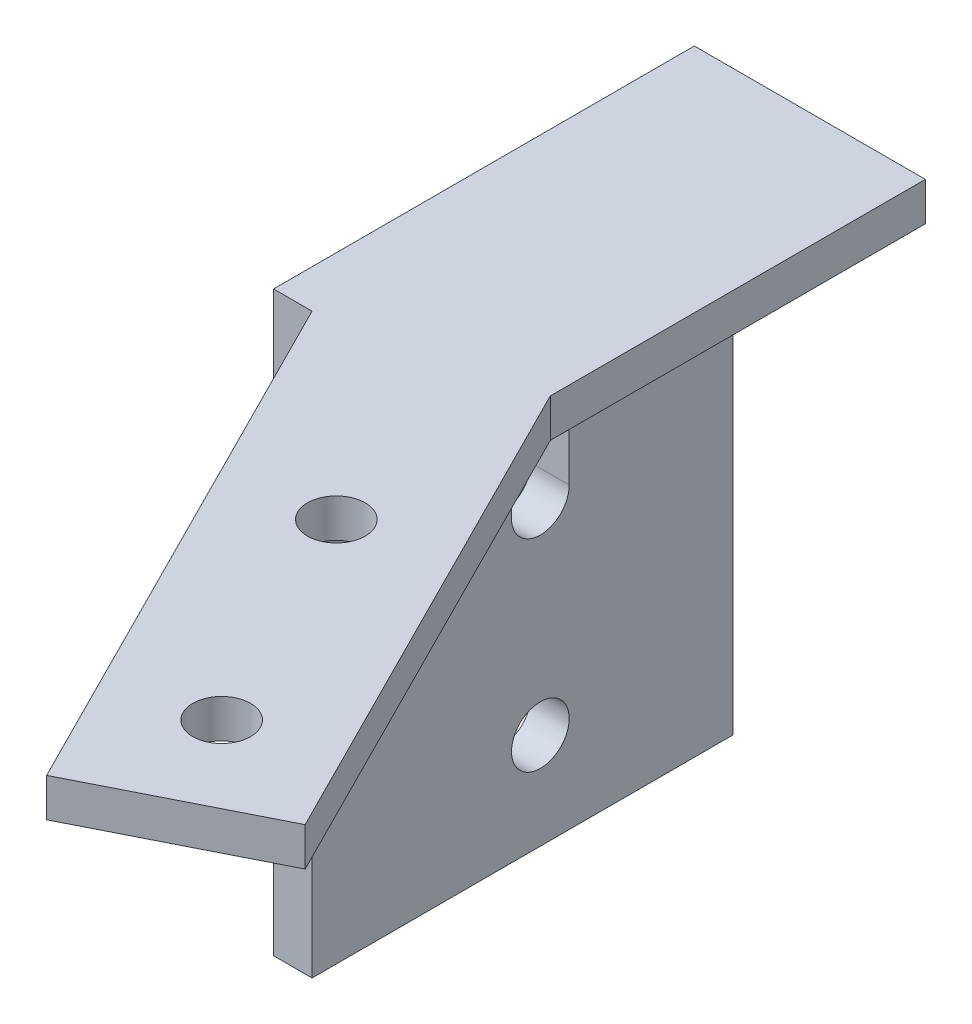
ISO-10303-21;
HEADER;
FILE_DESCRIPTION(('STEP AP214'),'2;1');
FILE_NAME('part.step','',(''),(''),'','','');
FILE_SCHEMA(('AUTOMOTIVE_DESIGN { 1 0 10303 214 1 1 1 1 }'));
ENDSEC;
DATA;
#1=APPLICATION_CONTEXT('core data for automotive mechanical design processes');
#2=APPLICATION_PROTOCOL_DEFINITION('international standard','automotive_design',2000,#1);
#3=PRODUCT_CONTEXT('',#1,'mechanical');
#4=PRODUCT('Part','Part','',(#3));
#5=PRODUCT_RELATED_PRODUCT_CATEGORY('part','',(#4));
#6=PRODUCT_DEFINITION_FORMATION('','',#4);
#7=PRODUCT_DEFINITION_CONTEXT('part definition',#1,'design');
#8=PRODUCT_DEFINITION('design','',#6,#7);
#9=PRODUCT_DEFINITION_SHAPE('','',#8);
#10=(LENGTH_UNIT() NAMED_UNIT(*) SI_UNIT(.MILLI.,.METRE.));
#11=(NAMED_UNIT(*) PLANE_ANGLE_UNIT() SI_UNIT($,.RADIAN.));
#12=(NAMED_UNIT(*) SI_UNIT($,.STERADIAN.) SOLID_ANGLE_UNIT());
#13=UNCERTAINTY_MEASURE_WITH_UNIT(LENGTH_MEASURE(1.E-05),#10,'distance_accuracy_value','');
#14=(GEOMETRIC_REPRESENTATION_CONTEXT(3) GLOBAL_UNCERTAINTY_ASSIGNED_CONTEXT((#13)) GLOBAL_UNIT_ASSIGNED_CONTEXT((#10,
#11,#12)) REPRESENTATION_CONTEXT('',''));
#15=CARTESIAN_POINT('',(0.,0.,0.));
#16=DIRECTION('',(0.,0.,1.));
#17=DIRECTION('',(1.,0.,0.));
#18=AXIS2_PLACEMENT_3D('',#15,#16,#17);
#19=CARTESIAN_POINT('',(0.,2.,0.));
#20=DIRECTION('',(0.,-1.,0.));
#21=DIRECTION('',(0.,0.,-1.));
#22=AXIS2_PLACEMENT_3D('',#19,#20,#21);
#23=PLANE('',#22);
#24=DIRECTION('',(0.893136002999645,0.,-0.449786705167925));
#25=VECTOR('',#24,1.);
#26=CARTESIAN_POINT('',(12.9202796453362,2.,14.5392623768898));
#27=LINE('',#26,#25);
#28=CARTESIAN_POINT('',(3.98891961533972,2.,19.037129428569));
#29=VERTEX_POINT('',#28);
#30=CARTESIAN_POINT('',(12.9202796453362,2.,14.5392623768898));
#31=VERTEX_POINT('',#30);
#32=EDGE_CURVE('E211',#29,#31,#27,.T.);
#33=ORIENTED_EDGE('',*,*,#32,.T.);
#34=DIRECTION('',(-0.449786705167925,0.,-0.893136002999645));
#35=VECTOR('',#34,1.);
#36=CARTESIAN_POINT('',(12.9202796453362,2.,14.5392623768898));
#37=LINE('',#36,#35);
#38=CARTESIAN_POINT('',(0.,2.,-11.1163801476375));
#39=VERTEX_POINT('',#38);
#40=EDGE_CURVE('E214',#31,#39,#37,.T.);
#41=ORIENTED_EDGE('',*,*,#40,.T.);
#42=DIRECTION('',(0.,0.,-1.));
#43=VECTOR('',#42,1.);
#44=CARTESIAN_POINT('',(0.,2.,-11.1163801476375));
#45=LINE('',#44,#43);
#46=CARTESIAN_POINT('',(0.,2.,-30.6));
#47=VERTEX_POINT('',#46);
#48=EDGE_CURVE('E217',#39,#47,#45,.T.);
#49=ORIENTED_EDGE('',*,*,#48,.T.);
#50=DIRECTION('',(-1.,0.,0.));
#51=VECTOR('',#50,1.);
#52=CARTESIAN_POINT('',(-10.,2.,-30.6));
#53=LINE('',#52,#51);
#54=CARTESIAN_POINT('',(-12.,2.,-30.6));
#55=VERTEX_POINT('',#54);
#56=EDGE_CURVE('E219',#47,#55,#53,.T.);
#57=ORIENTED_EDGE('',*,*,#56,.T.);
#58=DIRECTION('',(0.,0.,1.));
#59=VECTOR('',#58,1.);
#60=CARTESIAN_POINT('',(-12.,2.,-30.6));
#61=LINE('',#60,#59);
#62=CARTESIAN_POINT('',(-12.,2.,-8.74049851813361));
#63=VERTEX_POINT('',#62);
#64=EDGE_CURVE('E169',#55,#63,#61,.T.);
#65=ORIENTED_EDGE('',*,*,#64,.T.);
#66=DIRECTION('',(1.,0.,0.));
#67=VECTOR('',#66,1.);
#68=CARTESIAN_POINT('',(-12.,2.,-8.74049851813361));
#69=LINE('',#68,#67);
#70=CARTESIAN_POINT('',(-10.,2.,-8.74049851813361));
#71=VERTEX_POINT('',#70);
#72=EDGE_CURVE('E174',#63,#71,#69,.T.);
#73=ORIENTED_EDGE('',*,*,#72,.T.);
#74=DIRECTION('',(0.449786705167925,0.,0.893136002999645));
#75=VECTOR('',#74,1.);
#76=CARTESIAN_POINT('',(3.98891961533972,2.,19.037129428569));
#77=LINE('',#76,#75);
#78=EDGE_CURVE('E221',#71,#29,#77,.T.);
#79=ORIENTED_EDGE('',*,*,#78,.T.);
#80=EDGE_LOOP('',(#33,#41,#49,#57,#65,#73,#79));
#81=FACE_BOUND('',#80,.T.);
#82=CARTESIAN_POINT('',(0.,2.,0.));
#83=DIRECTION('',(0.,1.,0.));
#84=DIRECTION('',(0.,0.,1.));
#85=AXIS2_PLACEMENT_3D('',#82,#83,#84);
#86=CIRCLE('',#85,1.5);
#87=CARTESIAN_POINT('',(0.,2.,1.5));
#88=VERTEX_POINT('',#87);
#89=EDGE_CURVE('E205',#88,#88,#86,.T.);
#90=ORIENTED_EDGE('',*,*,#89,.F.);
#91=EDGE_LOOP('',(#90));
#92=FACE_BOUND('',#91,.T.);
#93=CARTESIAN_POINT('',(6.0432458706037,2.,12.));
#94=DIRECTION('',(0.,1.,0.));
#95=DIRECTION('',(0.,0.,1.));
#96=AXIS2_PLACEMENT_3D('',#93,#94,#95);
#97=CIRCLE('',#96,1.5);
#98=CARTESIAN_POINT('',(6.0432458706037,2.,13.5));
#99=VERTEX_POINT('',#98);
#100=EDGE_CURVE('E199',#99,#99,#97,.T.);
#101=ORIENTED_EDGE('',*,*,#100,.F.);
#102=EDGE_LOOP('',(#101));
#103=FACE_BOUND('',#102,.T.);
#104=ADVANCED_FACE('F36',(#81,#92,#103),#23,.F.);
#105=CARTESIAN_POINT('',(0.,0.,0.));
#106=DIRECTION('',(0.,-1.,0.));
#107=DIRECTION('',(0.,0.,-1.));
#108=AXIS2_PLACEMENT_3D('',#105,#106,#107);
#109=PLANE('',#108);
#110=CARTESIAN_POINT('',(0.,0.,0.));
#111=DIRECTION('',(0.,1.,0.));
#112=DIRECTION('',(0.,0.,1.));
#113=AXIS2_PLACEMENT_3D('',#110,#111,#112);
#114=CIRCLE('',#113,1.5);
#115=CARTESIAN_POINT('',(0.,0.,1.5));
#116=VERTEX_POINT('',#115);
#117=EDGE_CURVE('E202',#116,#116,#114,.T.);
#118=ORIENTED_EDGE('',*,*,#117,.T.);
#119=EDGE_LOOP('',(#118));
#120=FACE_BOUND('',#119,.T.);
#121=DIRECTION('',(0.893136002999645,0.,-0.449786705167925));
#122=VECTOR('',#121,1.);
#123=CARTESIAN_POINT('',(12.9202796453362,0.,14.5392623768898));
#124=LINE('',#123,#122);
#125=CARTESIAN_POINT('',(3.98891961533972,0.,19.037129428569));
#126=VERTEX_POINT('',#125);
#127=CARTESIAN_POINT('',(12.9202796453362,0.,14.5392623768898));
#128=VERTEX_POINT('',#127);
#129=EDGE_CURVE('E208',#126,#128,#124,.T.);
#130=ORIENTED_EDGE('',*,*,#129,.F.);
#131=DIRECTION('',(0.449786705167925,0.,0.893136002999645));
#132=VECTOR('',#131,1.);
#133=CARTESIAN_POINT('',(3.98891961533972,0.,19.037129428569));
#134=LINE('',#133,#132);
#135=CARTESIAN_POINT('',(-10.,0.,-8.74049851813361));
#136=VERTEX_POINT('',#135);
#137=EDGE_CURVE('E215',#136,#126,#134,.T.);
#138=ORIENTED_EDGE('',*,*,#137,.F.);
#139=DIRECTION('',(0.,0.,1.));
#140=VECTOR('',#139,1.);
#141=CARTESIAN_POINT('',(-10.,0.,-8.74049851813361));
#142=LINE('',#141,#140);
#143=CARTESIAN_POINT('',(-10.,0.,-30.6));
#144=VERTEX_POINT('',#143);
#145=EDGE_CURVE('E232',#144,#136,#142,.T.);
#146=ORIENTED_EDGE('',*,*,#145,.F.);
#147=DIRECTION('',(-1.,0.,0.));
#148=VECTOR('',#147,1.);
#149=CARTESIAN_POINT('',(-10.,0.,-30.6));
#150=LINE('',#149,#148);
#151=CARTESIAN_POINT('',(0.,0.,-30.6));
#152=VERTEX_POINT('',#151);
#153=EDGE_CURVE('E230',#152,#144,#150,.T.);
#154=ORIENTED_EDGE('',*,*,#153,.F.);
#155=DIRECTION('',(0.,0.,-1.));
#156=VECTOR('',#155,1.);
#157=CARTESIAN_POINT('',(0.,0.,-11.1163801476375));
#158=LINE('',#157,#156);
#159=CARTESIAN_POINT('',(0.,0.,-11.1163801476375));
#160=VERTEX_POINT('',#159);
#161=EDGE_CURVE('E228',#160,#152,#158,.T.);
#162=ORIENTED_EDGE('',*,*,#161,.F.);
#163=DIRECTION('',(-0.449786705167925,0.,-0.893136002999645));
#164=VECTOR('',#163,1.);
#165=CARTESIAN_POINT('',(12.9202796453362,0.,14.5392623768898));
#166=LINE('',#165,#164);
#167=EDGE_CURVE('E226',#128,#160,#166,.T.);
#168=ORIENTED_EDGE('',*,*,#167,.F.);
#169=EDGE_LOOP('',(#130,#138,#146,#154,#162,#168));
#170=FACE_BOUND('',#169,.T.);
#171=CARTESIAN_POINT('',(6.0432458706037,0.,12.));
#172=DIRECTION('',(0.,1.,0.));
#173=DIRECTION('',(0.,0.,1.));
#174=AXIS2_PLACEMENT_3D('',#171,#172,#173);
#175=CIRCLE('',#174,1.5);
#176=CARTESIAN_POINT('',(6.0432458706037,0.,13.5));
#177=VERTEX_POINT('',#176);
#178=EDGE_CURVE('E191',#177,#177,#175,.T.);
#179=ORIENTED_EDGE('',*,*,#178,.T.);
#180=EDGE_LOOP('',(#179));
#181=FACE_BOUND('',#180,.T.);
#182=ADVANCED_FACE('F254',(#120,#170,#181),#109,.T.);
#183=CARTESIAN_POINT('',(12.9202796453362,2.,14.5392623768898));
#184=DIRECTION('',(-0.449786705167925,0.,-0.893136002999645));
#185=DIRECTION('',(-0.893136002999645,0.,0.449786705167925));
#186=AXIS2_PLACEMENT_3D('',#183,#184,#185);
#187=PLANE('',#186);
#188=ORIENTED_EDGE('',*,*,#129,.T.);
#189=DIRECTION('',(0.,-1.,0.));
#190=VECTOR('',#189,1.);
#191=CARTESIAN_POINT('',(12.9202796453362,2.,14.5392623768898));
#192=LINE('',#191,#190);
#193=EDGE_CURVE('E12',#31,#128,#192,.T.);
#194=ORIENTED_EDGE('',*,*,#193,.F.);
#195=ORIENTED_EDGE('',*,*,#32,.F.);
#196=DIRECTION('',(0.,-1.,0.));
#197=VECTOR('',#196,1.);
#198=CARTESIAN_POINT('',(3.98891961533972,2.,19.037129428569));
#199=LINE('',#198,#197);
#200=EDGE_CURVE('E223',#29,#126,#199,.T.);
#201=ORIENTED_EDGE('',*,*,#200,.T.);
#202=EDGE_LOOP('',(#188,#194,#195,#201));
#203=FACE_BOUND('',#202,.T.);
#204=ADVANCED_FACE('F38',(#203),#187,.F.);
#205=CARTESIAN_POINT('',(12.9202796453362,2.,14.5392623768898));
#206=DIRECTION('',(-0.893136002999645,0.,0.449786705167925));
#207=DIRECTION('',(0.449786705167925,0.,0.893136002999645));
#208=AXIS2_PLACEMENT_3D('',#205,#206,#207);
#209=PLANE('',#208);
#210=ORIENTED_EDGE('',*,*,#167,.T.);
#211=DIRECTION('',(0.,-1.,0.));
#212=VECTOR('',#211,1.);
#213=CARTESIAN_POINT('',(0.,2.,-11.1163801476375));
#214=LINE('',#213,#212);
#215=EDGE_CURVE('E44',#39,#160,#214,.T.);
#216=ORIENTED_EDGE('',*,*,#215,.F.);
#217=ORIENTED_EDGE('',*,*,#40,.F.);
#218=ORIENTED_EDGE('',*,*,#193,.T.);
#219=EDGE_LOOP('',(#210,#216,#217,#218));
#220=FACE_BOUND('',#219,.T.);
#221=ADVANCED_FACE('F267',(#220),#209,.F.);
#222=CARTESIAN_POINT('',(0.,2.,-11.1163801476375));
#223=DIRECTION('',(-1.,0.,0.));
#224=DIRECTION('',(0.,0.,1.));
#225=AXIS2_PLACEMENT_3D('',#222,#223,#224);
#226=PLANE('',#225);
#227=ORIENTED_EDGE('',*,*,#161,.T.);
#228=DIRECTION('',(0.,-1.,0.));
#229=VECTOR('',#228,1.);
#230=CARTESIAN_POINT('',(0.,2.,-30.6));
#231=LINE('',#230,#229);
#232=EDGE_CURVE('E241',#47,#152,#231,.T.);
#233=ORIENTED_EDGE('',*,*,#232,.F.);
#234=ORIENTED_EDGE('',*,*,#48,.F.);
#235=ORIENTED_EDGE('',*,*,#215,.T.);
#236=EDGE_LOOP('',(#227,#233,#234,#235));
#237=FACE_BOUND('',#236,.T.);
#238=ADVANCED_FACE('F248',(#237),#226,.F.);
#239=CARTESIAN_POINT('',(-10.,2.,-30.6));
#240=DIRECTION('',(0.,0.,1.));
#241=DIRECTION('',(1.,0.,0.));
#242=AXIS2_PLACEMENT_3D('',#239,#240,#241);
#243=PLANE('',#242);
#244=ORIENTED_EDGE('',*,*,#153,.T.);
#245=DIRECTION('',(0.,1.,0.));
#246=VECTOR('',#245,1.);
#247=CARTESIAN_POINT('',(-10.,-28.,-30.6));
#248=LINE('',#247,#246);
#249=CARTESIAN_POINT('',(-10.,-28.,-30.6));
#250=VERTEX_POINT('',#249);
#251=EDGE_CURVE('E183',#250,#144,#248,.T.);
#252=ORIENTED_EDGE('',*,*,#251,.F.);
#253=DIRECTION('',(-1.,0.,0.));
#254=VECTOR('',#253,1.);
#255=CARTESIAN_POINT('',(-10.,-28.,-30.6));
#256=LINE('',#255,#254);
#257=CARTESIAN_POINT('',(-12.,-28.,-30.6));
#258=VERTEX_POINT('',#257);
#259=EDGE_CURVE('E173',#250,#258,#256,.T.);
#260=ORIENTED_EDGE('',*,*,#259,.T.);
#261=DIRECTION('',(0.,1.,0.));
#262=VECTOR('',#261,1.);
#263=CARTESIAN_POINT('',(-12.,-28.,-30.6));
#264=LINE('',#263,#262);
#265=EDGE_CURVE('E194',#258,#55,#264,.T.);
#266=ORIENTED_EDGE('',*,*,#265,.T.);
#267=ORIENTED_EDGE('',*,*,#56,.F.);
#268=ORIENTED_EDGE('',*,*,#232,.T.);
#269=EDGE_LOOP('',(#244,#252,#260,#266,#267,#268));
#270=FACE_BOUND('',#269,.T.);
#271=ADVANCED_FACE('F258',(#270),#243,.F.);
#272=CARTESIAN_POINT('',(3.98891961533972,2.,19.037129428569));
#273=DIRECTION('',(0.893136002999645,0.,-0.449786705167925));
#274=DIRECTION('',(-0.449786705167925,0.,-0.893136002999645));
#275=AXIS2_PLACEMENT_3D('',#272,#273,#274);
#276=PLANE('',#275);
#277=ORIENTED_EDGE('',*,*,#137,.T.);
#278=ORIENTED_EDGE('',*,*,#200,.F.);
#279=ORIENTED_EDGE('',*,*,#78,.F.);
#280=DIRECTION('',(0.,-1.,0.));
#281=VECTOR('',#280,1.);
#282=CARTESIAN_POINT('',(-10.,2.,-8.74049851813361));
#283=LINE('',#282,#281);
#284=EDGE_CURVE('E238',#71,#136,#283,.T.);
#285=ORIENTED_EDGE('',*,*,#284,.T.);
#286=EDGE_LOOP('',(#277,#278,#279,#285));
#287=FACE_BOUND('',#286,.T.);
#288=ADVANCED_FACE('F272',(#287),#276,.F.);
#289=CARTESIAN_POINT('',(0.,2.,0.));
#290=DIRECTION('',(0.,-1.,0.));
#291=DIRECTION('',(0.,0.,-1.));
#292=AXIS2_PLACEMENT_3D('',#289,#290,#291);
#293=CYLINDRICAL_SURFACE('',#292,1.5);
#294=ORIENTED_EDGE('',*,*,#89,.T.);
#295=EDGE_LOOP('',(#294));
#296=FACE_BOUND('',#295,.T.);
#297=ORIENTED_EDGE('',*,*,#117,.F.);
#298=EDGE_LOOP('',(#297));
#299=FACE_BOUND('',#298,.T.);
#300=ADVANCED_FACE('F301',(#296,#299),#293,.F.);
#301=CARTESIAN_POINT('',(6.0432458706037,2.,12.));
#302=DIRECTION('',(0.,-1.,0.));
#303=DIRECTION('',(0.,0.,-1.));
#304=AXIS2_PLACEMENT_3D('',#301,#302,#303);
#305=CYLINDRICAL_SURFACE('',#304,1.5);
#306=ORIENTED_EDGE('',*,*,#100,.T.);
#307=EDGE_LOOP('',(#306));
#308=FACE_BOUND('',#307,.T.);
#309=ORIENTED_EDGE('',*,*,#178,.F.);
#310=EDGE_LOOP('',(#309));
#311=FACE_BOUND('',#310,.T.);
#312=ADVANCED_FACE('F371',(#308,#311),#305,.F.);
#313=CARTESIAN_POINT('',(-10.,-28.,-30.6));
#314=DIRECTION('',(1.,0.,0.));
#315=DIRECTION('',(0.,0.,-1.));
#316=AXIS2_PLACEMENT_3D('',#313,#314,#315);
#317=PLANE('',#316);
#318=CARTESIAN_POINT('',(-10.,-3.5,-20.6));
#319=DIRECTION('',(1.,0.,0.));
#320=DIRECTION('',(0.,0.,-1.));
#321=AXIS2_PLACEMENT_3D('',#318,#319,#320);
#322=CIRCLE('',#321,1.5);
#323=CARTESIAN_POINT('',(-10.,-3.5,-22.1));
#324=VERTEX_POINT('',#323);
#325=CARTESIAN_POINT('',(-10.,-3.5,-19.1));
#326=VERTEX_POINT('',#325);
#327=EDGE_CURVE('E161',#324,#326,#322,.T.);
#328=ORIENTED_EDGE('',*,*,#327,.F.);
#329=DIRECTION('',(0.,1.,0.));
#330=VECTOR('',#329,1.);
#331=CARTESIAN_POINT('',(-10.,-28.,-22.1));
#332=LINE('',#331,#330);
#333=CARTESIAN_POINT('',(-10.,-12.5,-22.1));
#334=VERTEX_POINT('',#333);
#335=EDGE_CURVE('E154',#334,#324,#332,.T.);
#336=ORIENTED_EDGE('',*,*,#335,.F.);
#337=CARTESIAN_POINT('',(-10.,-12.5,-20.6));
#338=DIRECTION('',(1.,0.,0.));
#339=DIRECTION('',(0.,0.,-1.));
#340=AXIS2_PLACEMENT_3D('',#337,#338,#339);
#341=CIRCLE('',#340,1.5);
#342=CARTESIAN_POINT('',(-10.,-12.5,-19.1));
#343=VERTEX_POINT('',#342);
#344=EDGE_CURVE('E134',#343,#334,#341,.T.);
#345=ORIENTED_EDGE('',*,*,#344,.F.);
#346=DIRECTION('',(0.,-1.,0.));
#347=VECTOR('',#346,1.);
#348=CARTESIAN_POINT('',(-10.,-28.,-19.1));
#349=LINE('',#348,#347);
#350=EDGE_CURVE('E159',#326,#343,#349,.T.);
#351=ORIENTED_EDGE('',*,*,#350,.F.);
#352=EDGE_LOOP('',(#328,#336,#345,#351));
#353=FACE_BOUND('',#352,.T.);
#354=CARTESIAN_POINT('',(-10.,-23.,-20.6));
#355=DIRECTION('',(1.,0.,0.));
#356=DIRECTION('',(0.,0.,-1.));
#357=AXIS2_PLACEMENT_3D('',#354,#355,#356);
#358=CIRCLE('',#357,1.5);
#359=CARTESIAN_POINT('',(-10.,-23.,-22.1));
#360=VERTEX_POINT('',#359);
#361=EDGE_CURVE('E166',#360,#360,#358,.T.);
#362=ORIENTED_EDGE('',*,*,#361,.F.);
#363=EDGE_LOOP('',(#362));
#364=FACE_BOUND('',#363,.T.);
#365=ORIENTED_EDGE('',*,*,#251,.T.);
#366=ORIENTED_EDGE('',*,*,#145,.T.);
#367=DIRECTION('',(0.,1.,0.));
#368=VECTOR('',#367,1.);
#369=CARTESIAN_POINT('',(-10.,-28.,-8.74049851813361));
#370=LINE('',#369,#368);
#371=CARTESIAN_POINT('',(-10.,-28.,-8.74049851813361));
#372=VERTEX_POINT('',#371);
#373=EDGE_CURVE('E188',#372,#136,#370,.T.);
#374=ORIENTED_EDGE('',*,*,#373,.F.);
#375=DIRECTION('',(0.,0.,-1.));
#376=VECTOR('',#375,1.);
#377=CARTESIAN_POINT('',(-10.,-28.,-30.6));
#378=LINE('',#377,#376);
#379=EDGE_CURVE('E170',#372,#250,#378,.T.);
#380=ORIENTED_EDGE('',*,*,#379,.T.);
#381=EDGE_LOOP('',(#365,#366,#374,#380));
#382=FACE_BOUND('',#381,.T.);
#383=ADVANCED_FACE('F275',(#353,#364,#382),#317,.T.);
#384=CARTESIAN_POINT('',(-12.,-28.,-8.74049851813361));
#385=DIRECTION('',(0.,0.,1.));
#386=DIRECTION('',(1.,0.,0.));
#387=AXIS2_PLACEMENT_3D('',#384,#385,#386);
#388=PLANE('',#387);
#389=ORIENTED_EDGE('',*,*,#72,.F.);
#390=DIRECTION('',(0.,1.,0.));
#391=VECTOR('',#390,1.);
#392=CARTESIAN_POINT('',(-12.,-28.,-8.74049851813361));
#393=LINE('',#392,#391);
#394=CARTESIAN_POINT('',(-12.,-28.,-8.74049851813361));
#395=VERTEX_POINT('',#394);
#396=EDGE_CURVE('E192',#395,#63,#393,.T.);
#397=ORIENTED_EDGE('',*,*,#396,.F.);
#398=DIRECTION('',(1.,0.,0.));
#399=VECTOR('',#398,1.);
#400=CARTESIAN_POINT('',(-12.,-28.,-8.74049851813361));
#401=LINE('',#400,#399);
#402=EDGE_CURVE('E180',#395,#372,#401,.T.);
#403=ORIENTED_EDGE('',*,*,#402,.T.);
#404=ORIENTED_EDGE('',*,*,#373,.T.);
#405=ORIENTED_EDGE('',*,*,#284,.F.);
#406=EDGE_LOOP('',(#389,#397,#403,#404,#405));
#407=FACE_BOUND('',#406,.T.);
#408=ADVANCED_FACE('F277',(#407),#388,.T.);
#409=CARTESIAN_POINT('',(-12.,-28.,-30.6));
#410=DIRECTION('',(-1.,0.,0.));
#411=DIRECTION('',(0.,0.,1.));
#412=AXIS2_PLACEMENT_3D('',#409,#410,#411);
#413=PLANE('',#412);
#414=CARTESIAN_POINT('',(-12.,-3.5,-20.6));
#415=DIRECTION('',(-1.,0.,0.));
#416=DIRECTION('',(0.,0.,1.));
#417=AXIS2_PLACEMENT_3D('',#414,#415,#416);
#418=CIRCLE('',#417,1.5);
#419=CARTESIAN_POINT('',(-12.,-3.5,-19.1));
#420=VERTEX_POINT('',#419);
#421=CARTESIAN_POINT('',(-12.,-3.5,-22.1));
#422=VERTEX_POINT('',#421);
#423=EDGE_CURVE('E59',#420,#422,#418,.T.);
#424=ORIENTED_EDGE('',*,*,#423,.F.);
#425=DIRECTION('',(0.,1.,0.));
#426=VECTOR('',#425,1.);
#427=CARTESIAN_POINT('',(-12.,-3.5,-19.1));
#428=LINE('',#427,#426);
#429=CARTESIAN_POINT('',(-12.,-12.5,-19.1));
#430=VERTEX_POINT('',#429);
#431=EDGE_CURVE('E147',#430,#420,#428,.T.);
#432=ORIENTED_EDGE('',*,*,#431,.F.);
#433=CARTESIAN_POINT('',(-12.,-12.5,-20.6));
#434=DIRECTION('',(-1.,0.,0.));
#435=DIRECTION('',(0.,0.,1.));
#436=AXIS2_PLACEMENT_3D('',#433,#434,#435);
#437=CIRCLE('',#436,1.5);
#438=CARTESIAN_POINT('',(-12.,-12.5,-22.1));
#439=VERTEX_POINT('',#438);
#440=EDGE_CURVE('E131',#439,#430,#437,.T.);
#441=ORIENTED_EDGE('',*,*,#440,.F.);
#442=DIRECTION('',(0.,-1.,0.));
#443=VECTOR('',#442,1.);
#444=CARTESIAN_POINT('',(-12.,-3.5,-22.1));
#445=LINE('',#444,#443);
#446=EDGE_CURVE('E140',#422,#439,#445,.T.);
#447=ORIENTED_EDGE('',*,*,#446,.F.);
#448=EDGE_LOOP('',(#424,#432,#441,#447));
#449=FACE_BOUND('',#448,.T.);
#450=CARTESIAN_POINT('',(-12.,-23.,-20.6));
#451=DIRECTION('',(1.,0.,0.));
#452=DIRECTION('',(0.,0.,-1.));
#453=AXIS2_PLACEMENT_3D('',#450,#451,#452);
#454=CIRCLE('',#453,1.5);
#455=CARTESIAN_POINT('',(-12.,-23.,-22.1));
#456=VERTEX_POINT('',#455);
#457=EDGE_CURVE('E163',#456,#456,#454,.T.);
#458=ORIENTED_EDGE('',*,*,#457,.T.);
#459=EDGE_LOOP('',(#458));
#460=FACE_BOUND('',#459,.T.);
#461=ORIENTED_EDGE('',*,*,#64,.F.);
#462=ORIENTED_EDGE('',*,*,#265,.F.);
#463=DIRECTION('',(0.,0.,1.));
#464=VECTOR('',#463,1.);
#465=CARTESIAN_POINT('',(-12.,-28.,-30.6));
#466=LINE('',#465,#464);
#467=EDGE_CURVE('E177',#258,#395,#466,.T.);
#468=ORIENTED_EDGE('',*,*,#467,.T.);
#469=ORIENTED_EDGE('',*,*,#396,.T.);
#470=EDGE_LOOP('',(#461,#462,#468,#469));
#471=FACE_BOUND('',#470,.T.);
#472=ADVANCED_FACE('F144',(#449,#460,#471),#413,.T.);
#473=CARTESIAN_POINT('',(0.,-28.,0.));
#474=DIRECTION('',(0.,1.,0.));
#475=DIRECTION('',(0.,0.,1.));
#476=AXIS2_PLACEMENT_3D('',#473,#474,#475);
#477=PLANE('',#476);
#478=ORIENTED_EDGE('',*,*,#379,.F.);
#479=ORIENTED_EDGE('',*,*,#402,.F.);
#480=ORIENTED_EDGE('',*,*,#467,.F.);
#481=ORIENTED_EDGE('',*,*,#259,.F.);
#482=EDGE_LOOP('',(#478,#479,#480,#481));
#483=FACE_BOUND('',#482,.T.);
#484=ADVANCED_FACE('F281',(#483),#477,.F.);
#485=CARTESIAN_POINT('',(-12.,-23.,-20.6));
#486=DIRECTION('',(1.,0.,0.));
#487=DIRECTION('',(0.,0.,-1.));
#488=AXIS2_PLACEMENT_3D('',#485,#486,#487);
#489=CYLINDRICAL_SURFACE('',#488,1.5);
#490=ORIENTED_EDGE('',*,*,#361,.T.);
#491=EDGE_LOOP('',(#490));
#492=FACE_BOUND('',#491,.T.);
#493=ORIENTED_EDGE('',*,*,#457,.F.);
#494=EDGE_LOOP('',(#493));
#495=FACE_BOUND('',#494,.T.);
#496=ADVANCED_FACE('F289',(#492,#495),#489,.F.);
#497=CARTESIAN_POINT('',(18.,-3.5,-20.6));
#498=DIRECTION('',(-1.,0.,0.));
#499=DIRECTION('',(0.,0.,1.));
#500=AXIS2_PLACEMENT_3D('',#497,#498,#499);
#501=CYLINDRICAL_SURFACE('',#500,1.5);
#502=ORIENTED_EDGE('',*,*,#327,.T.);
#503=DIRECTION('',(-1.,0.,0.));
#504=VECTOR('',#503,1.);
#505=CARTESIAN_POINT('',(18.,-3.5,-19.1));
#506=LINE('',#505,#504);
#507=EDGE_CURVE('E152',#326,#420,#506,.T.);
#508=ORIENTED_EDGE('',*,*,#507,.T.);
#509=ORIENTED_EDGE('',*,*,#423,.T.);
#510=DIRECTION('',(-1.,0.,0.));
#511=VECTOR('',#510,1.);
#512=CARTESIAN_POINT('',(18.,-3.5,-22.1));
#513=LINE('',#512,#511);
#514=EDGE_CURVE('E137',#324,#422,#513,.T.);
#515=ORIENTED_EDGE('',*,*,#514,.F.);
#516=EDGE_LOOP('',(#502,#508,#509,#515));
#517=FACE_BOUND('',#516,.T.);
#518=ADVANCED_FACE('F362',(#517),#501,.F.);
#519=CARTESIAN_POINT('',(18.,-3.5,-19.1));
#520=DIRECTION('',(0.,0.,1.));
#521=DIRECTION('',(1.,0.,0.));
#522=AXIS2_PLACEMENT_3D('',#519,#520,#521);
#523=PLANE('',#522);
#524=ORIENTED_EDGE('',*,*,#350,.T.);
#525=DIRECTION('',(-1.,0.,0.));
#526=VECTOR('',#525,1.);
#527=CARTESIAN_POINT('',(18.,-12.5,-19.1));
#528=LINE('',#527,#526);
#529=EDGE_CURVE('E136',#343,#430,#528,.T.);
#530=ORIENTED_EDGE('',*,*,#529,.T.);
#531=ORIENTED_EDGE('',*,*,#431,.T.);
#532=ORIENTED_EDGE('',*,*,#507,.F.);
#533=EDGE_LOOP('',(#524,#530,#531,#532));
#534=FACE_BOUND('',#533,.T.);
#535=ADVANCED_FACE('F383',(#534),#523,.F.);
#536=CARTESIAN_POINT('',(18.,-12.5,-20.6));
#537=DIRECTION('',(-1.,0.,0.));
#538=DIRECTION('',(0.,0.,1.));
#539=AXIS2_PLACEMENT_3D('',#536,#537,#538);
#540=CYLINDRICAL_SURFACE('',#539,1.5);
#541=ORIENTED_EDGE('',*,*,#344,.T.);
#542=DIRECTION('',(-1.,0.,0.));
#543=VECTOR('',#542,1.);
#544=CARTESIAN_POINT('',(18.,-12.5,-22.1));
#545=LINE('',#544,#543);
#546=EDGE_CURVE('E51',#334,#439,#545,.T.);
#547=ORIENTED_EDGE('',*,*,#546,.T.);
#548=ORIENTED_EDGE('',*,*,#440,.T.);
#549=ORIENTED_EDGE('',*,*,#529,.F.);
#550=EDGE_LOOP('',(#541,#547,#548,#549));
#551=FACE_BOUND('',#550,.T.);
#552=ADVANCED_FACE('F128',(#551),#540,.F.);
#553=CARTESIAN_POINT('',(18.,-3.5,-22.1));
#554=DIRECTION('',(0.,0.,-1.));
#555=DIRECTION('',(-1.,0.,0.));
#556=AXIS2_PLACEMENT_3D('',#553,#554,#555);
#557=PLANE('',#556);
#558=ORIENTED_EDGE('',*,*,#335,.T.);
#559=ORIENTED_EDGE('',*,*,#514,.T.);
#560=ORIENTED_EDGE('',*,*,#446,.T.);
#561=ORIENTED_EDGE('',*,*,#546,.F.);
#562=EDGE_LOOP('',(#558,#559,#560,#561));
#563=FACE_BOUND('',#562,.T.);
#564=ADVANCED_FACE('F141',(#563),#557,.F.);
#565=CLOSED_SHELL('',(#104,#182,#204,#221,#238,#271,#288,#300,#312,#383,#408,#472,#484,#496,
#518,#535,#552,#564));
#566=MANIFOLD_SOLID_BREP('B2',#565);
#567=ADVANCED_BREP_SHAPE_REPRESENTATION('',(#18,#566),#14);
#568=SHAPE_DEFINITION_REPRESENTATION(#9,#567);
ENDSEC;
END-ISO-10303-21;
